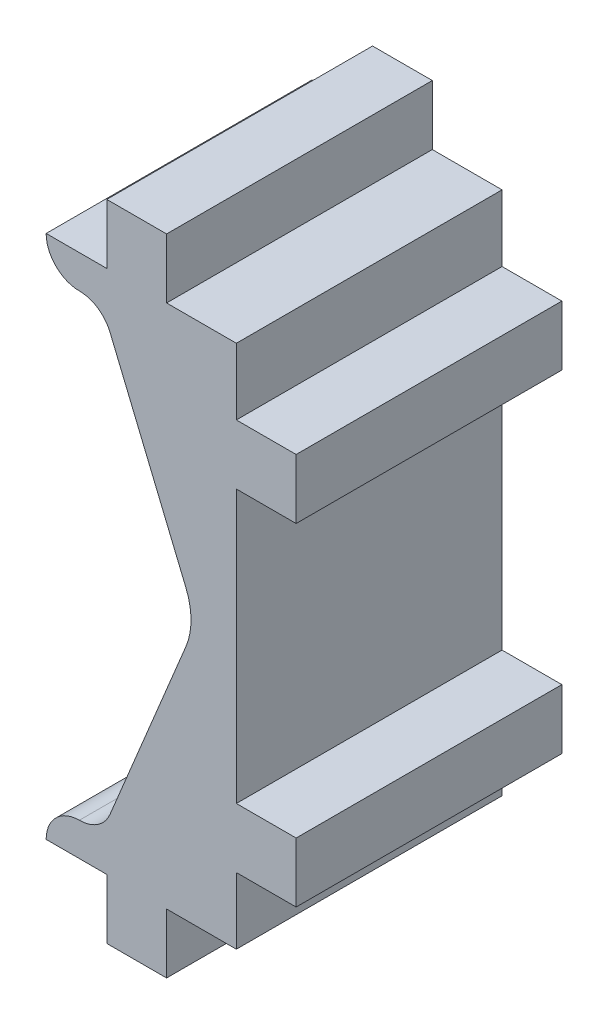
ISO-10303-21;
HEADER;
FILE_DESCRIPTION(('STEP AP214'),'2;1');
FILE_NAME('part.step','',(''),(''),'','','');
FILE_SCHEMA(('AUTOMOTIVE_DESIGN { 1 0 10303 214 1 1 1 1 }'));
ENDSEC;
DATA;
#1=APPLICATION_CONTEXT('core data for automotive mechanical design processes');
#2=APPLICATION_PROTOCOL_DEFINITION('international standard','automotive_design',2000,#1);
#3=PRODUCT_CONTEXT('',#1,'mechanical');
#4=PRODUCT('Part','Part','',(#3));
#5=PRODUCT_RELATED_PRODUCT_CATEGORY('part','',(#4));
#6=PRODUCT_DEFINITION_FORMATION('','',#4);
#7=PRODUCT_DEFINITION_CONTEXT('part definition',#1,'design');
#8=PRODUCT_DEFINITION('design','',#6,#7);
#9=PRODUCT_DEFINITION_SHAPE('','',#8);
#10=(LENGTH_UNIT() NAMED_UNIT(*) SI_UNIT(.MILLI.,.METRE.));
#11=(NAMED_UNIT(*) PLANE_ANGLE_UNIT() SI_UNIT($,.RADIAN.));
#12=(NAMED_UNIT(*) SI_UNIT($,.STERADIAN.) SOLID_ANGLE_UNIT());
#13=UNCERTAINTY_MEASURE_WITH_UNIT(LENGTH_MEASURE(1.E-05),#10,'distance_accuracy_value','');
#14=(GEOMETRIC_REPRESENTATION_CONTEXT(3) GLOBAL_UNCERTAINTY_ASSIGNED_CONTEXT((#13)) GLOBAL_UNIT_ASSIGNED_CONTEXT((#10,
#11,#12)) REPRESENTATION_CONTEXT('',''));
#15=CARTESIAN_POINT('',(0.,0.,0.));
#16=DIRECTION('',(0.,0.,1.));
#17=DIRECTION('',(1.,0.,0.));
#18=AXIS2_PLACEMENT_3D('',#15,#16,#17);
#19=CARTESIAN_POINT('',(0.,0.,8.));
#20=DIRECTION('',(0.923879532511285,-0.382683432365094,0.));
#21=DIRECTION('',(0.382683432365094,0.923879532511285,0.));
#22=AXIS2_PLACEMENT_3D('',#19,#20,#21);
#23=PLANE('',#22);
#24=DIRECTION('',(-0.382683432365094,-0.923879532511285,0.));
#25=VECTOR('',#24,1.);
#26=CARTESIAN_POINT('',(0.,0.,8.));
#27=LINE('',#26,#25);
#28=CARTESIAN_POINT('',(-0.317025335562221,-0.765366864730187,8.));
#29=VERTEX_POINT('',#28);
#30=CARTESIAN_POINT('',(-2.6023726857824,-6.2826834323651,8.));
#31=VERTEX_POINT('',#30);
#32=EDGE_CURVE('E204',#29,#31,#27,.T.);
#33=ORIENTED_EDGE('',*,*,#32,.F.);
#34=DIRECTION('',(0.,0.,-1.));
#35=VECTOR('',#34,1.);
#36=CARTESIAN_POINT('',(-0.317025335562221,-0.765366864730187,0.));
#37=LINE('',#36,#35);
#38=CARTESIAN_POINT('',(-0.317025335562221,-0.765366864730187,0.));
#39=VERTEX_POINT('',#38);
#40=EDGE_CURVE('E227',#29,#39,#37,.T.);
#41=ORIENTED_EDGE('',*,*,#40,.T.);
#42=DIRECTION('',(-0.382683432365094,-0.923879532511285,0.));
#43=VECTOR('',#42,1.);
#44=CARTESIAN_POINT('',(0.,0.,0.));
#45=LINE('',#44,#43);
#46=CARTESIAN_POINT('',(-2.6023726857824,-6.2826834323651,0.));
#47=VERTEX_POINT('',#46);
#48=EDGE_CURVE('E225',#39,#47,#45,.T.);
#49=ORIENTED_EDGE('',*,*,#48,.T.);
#50=DIRECTION('',(0.,0.,-1.));
#51=VECTOR('',#50,1.);
#52=CARTESIAN_POINT('',(-2.6023726857824,-6.2826834323651,8.));
#53=LINE('',#52,#51);
#54=EDGE_CURVE('E219',#31,#47,#53,.T.);
#55=ORIENTED_EDGE('',*,*,#54,.F.);
#56=EDGE_LOOP('',(#33,#41,#49,#55));
#57=FACE_BOUND('',#56,.T.);
#58=ADVANCED_FACE('F32',(#57),#23,.F.);
#59=CARTESIAN_POINT('',(-3.52625221829369,-5.9,8.));
#60=DIRECTION('',(0.,0.,-1.));
#61=DIRECTION('',(-1.,0.,0.));
#62=AXIS2_PLACEMENT_3D('',#59,#60,#61);
#63=CYLINDRICAL_SURFACE('',#62,1.);
#64=CARTESIAN_POINT('',(-3.52625221829369,-5.9,0.));
#65=DIRECTION('',(0.,0.,-1.));
#66=DIRECTION('',(-1.,0.,0.));
#67=AXIS2_PLACEMENT_3D('',#64,#65,#66);
#68=CIRCLE('',#67,1.);
#69=CARTESIAN_POINT('',(-3.52625221829369,-6.9,0.));
#70=VERTEX_POINT('',#69);
#71=EDGE_CURVE('E345',#47,#70,#68,.T.);
#72=ORIENTED_EDGE('',*,*,#71,.T.);
#73=DIRECTION('',(0.,0.,-1.));
#74=VECTOR('',#73,1.);
#75=CARTESIAN_POINT('',(-3.52625221829369,-6.9,8.));
#76=LINE('',#75,#74);
#77=CARTESIAN_POINT('',(-3.52625221829369,-6.9,8.));
#78=VERTEX_POINT('',#77);
#79=EDGE_CURVE('E221',#78,#70,#76,.T.);
#80=ORIENTED_EDGE('',*,*,#79,.F.);
#81=CARTESIAN_POINT('',(-3.52625221829369,-5.9,8.));
#82=DIRECTION('',(0.,0.,-1.));
#83=DIRECTION('',(-1.,0.,0.));
#84=AXIS2_PLACEMENT_3D('',#81,#82,#83);
#85=CIRCLE('',#84,1.);
#86=EDGE_CURVE('E207',#31,#78,#85,.T.);
#87=ORIENTED_EDGE('',*,*,#86,.F.);
#88=ORIENTED_EDGE('',*,*,#54,.T.);
#89=EDGE_LOOP('',(#72,#80,#87,#88));
#90=FACE_BOUND('',#89,.T.);
#91=ADVANCED_FACE('F218',(#90),#63,.F.);
#92=CARTESIAN_POINT('',(-3.52625221829369,-7.9,8.));
#93=DIRECTION('',(0.,0.,-1.));
#94=DIRECTION('',(-1.,0.,0.));
#95=AXIS2_PLACEMENT_3D('',#92,#93,#94);
#96=CYLINDRICAL_SURFACE('',#95,1.);
#97=CARTESIAN_POINT('',(-3.52625221829369,-7.9,0.));
#98=DIRECTION('',(0.,0.,1.));
#99=DIRECTION('',(1.,0.,0.));
#100=AXIS2_PLACEMENT_3D('',#97,#98,#99);
#101=CIRCLE('',#100,1.);
#102=CARTESIAN_POINT('',(-4.52625221829369,-7.9,0.));
#103=VERTEX_POINT('',#102);
#104=EDGE_CURVE('E343',#70,#103,#101,.T.);
#105=ORIENTED_EDGE('',*,*,#104,.T.);
#106=DIRECTION('',(0.,0.,-1.));
#107=VECTOR('',#106,1.);
#108=CARTESIAN_POINT('',(-4.52625221829369,-7.9,8.));
#109=LINE('',#108,#107);
#110=CARTESIAN_POINT('',(-4.52625221829369,-7.9,8.));
#111=VERTEX_POINT('',#110);
#112=EDGE_CURVE('E230',#111,#103,#109,.T.);
#113=ORIENTED_EDGE('',*,*,#112,.F.);
#114=CARTESIAN_POINT('',(-3.52625221829369,-7.9,8.));
#115=DIRECTION('',(0.,0.,1.));
#116=DIRECTION('',(1.,0.,0.));
#117=AXIS2_PLACEMENT_3D('',#114,#115,#116);
#118=CIRCLE('',#117,1.);
#119=EDGE_CURVE('E223',#78,#111,#118,.T.);
#120=ORIENTED_EDGE('',*,*,#119,.F.);
#121=ORIENTED_EDGE('',*,*,#79,.T.);
#122=EDGE_LOOP('',(#105,#113,#120,#121));
#123=FACE_BOUND('',#122,.T.);
#124=ADVANCED_FACE('F395',(#123),#96,.T.);
#125=CARTESIAN_POINT('',(-2.7,-7.9,8.));
#126=DIRECTION('',(0.,1.,0.));
#127=DIRECTION('',(-1.,0.,0.));
#128=AXIS2_PLACEMENT_3D('',#125,#126,#127);
#129=PLANE('',#128);
#130=DIRECTION('',(1.,0.,0.));
#131=VECTOR('',#130,1.);
#132=CARTESIAN_POINT('',(-2.7,-7.9,0.));
#133=LINE('',#132,#131);
#134=CARTESIAN_POINT('',(-2.7,-7.9,0.));
#135=VERTEX_POINT('',#134);
#136=EDGE_CURVE('E341',#103,#135,#133,.T.);
#137=ORIENTED_EDGE('',*,*,#136,.T.);
#138=DIRECTION('',(0.,0.,-1.));
#139=VECTOR('',#138,1.);
#140=CARTESIAN_POINT('',(-2.7,-7.9,8.));
#141=LINE('',#140,#139);
#142=CARTESIAN_POINT('',(-2.7,-7.9,8.));
#143=VERTEX_POINT('',#142);
#144=EDGE_CURVE('E236',#143,#135,#141,.T.);
#145=ORIENTED_EDGE('',*,*,#144,.F.);
#146=DIRECTION('',(1.,0.,0.));
#147=VECTOR('',#146,1.);
#148=CARTESIAN_POINT('',(-2.7,-7.9,8.));
#149=LINE('',#148,#147);
#150=EDGE_CURVE('E389',#111,#143,#149,.T.);
#151=ORIENTED_EDGE('',*,*,#150,.F.);
#152=ORIENTED_EDGE('',*,*,#112,.T.);
#153=EDGE_LOOP('',(#137,#145,#151,#152));
#154=FACE_BOUND('',#153,.T.);
#155=ADVANCED_FACE('F399',(#154),#129,.F.);
#156=CARTESIAN_POINT('',(-2.7,-9.7,8.));
#157=DIRECTION('',(1.,0.,0.));
#158=DIRECTION('',(0.,0.,-1.));
#159=AXIS2_PLACEMENT_3D('',#156,#157,#158);
#160=PLANE('',#159);
#161=DIRECTION('',(0.,-1.,0.));
#162=VECTOR('',#161,1.);
#163=CARTESIAN_POINT('',(-2.7,-9.7,0.));
#164=LINE('',#163,#162);
#165=CARTESIAN_POINT('',(-2.7,-9.7,0.));
#166=VERTEX_POINT('',#165);
#167=EDGE_CURVE('E339',#135,#166,#164,.T.);
#168=ORIENTED_EDGE('',*,*,#167,.T.);
#169=DIRECTION('',(0.,0.,-1.));
#170=VECTOR('',#169,1.);
#171=CARTESIAN_POINT('',(-2.7,-9.7,8.));
#172=LINE('',#171,#170);
#173=CARTESIAN_POINT('',(-2.7,-9.7,8.));
#174=VERTEX_POINT('',#173);
#175=EDGE_CURVE('E239',#174,#166,#172,.T.);
#176=ORIENTED_EDGE('',*,*,#175,.F.);
#177=DIRECTION('',(0.,-1.,0.));
#178=VECTOR('',#177,1.);
#179=CARTESIAN_POINT('',(-2.7,-9.7,8.));
#180=LINE('',#179,#178);
#181=EDGE_CURVE('E387',#143,#174,#180,.T.);
#182=ORIENTED_EDGE('',*,*,#181,.F.);
#183=ORIENTED_EDGE('',*,*,#144,.T.);
#184=EDGE_LOOP('',(#168,#176,#182,#183));
#185=FACE_BOUND('',#184,.T.);
#186=ADVANCED_FACE('F404',(#185),#160,.F.);
#187=CARTESIAN_POINT('',(-0.900000000000001,-9.7,8.));
#188=DIRECTION('',(0.,1.,0.));
#189=DIRECTION('',(-1.,0.,0.));
#190=AXIS2_PLACEMENT_3D('',#187,#188,#189);
#191=PLANE('',#190);
#192=DIRECTION('',(1.,0.,0.));
#193=VECTOR('',#192,1.);
#194=CARTESIAN_POINT('',(-0.900000000000001,-9.7,0.));
#195=LINE('',#194,#193);
#196=CARTESIAN_POINT('',(-0.900000000000001,-9.7,0.));
#197=VERTEX_POINT('',#196);
#198=EDGE_CURVE('E337',#166,#197,#195,.T.);
#199=ORIENTED_EDGE('',*,*,#198,.T.);
#200=DIRECTION('',(0.,0.,-1.));
#201=VECTOR('',#200,1.);
#202=CARTESIAN_POINT('',(-0.900000000000001,-9.7,8.));
#203=LINE('',#202,#201);
#204=CARTESIAN_POINT('',(-0.900000000000001,-9.7,8.));
#205=VERTEX_POINT('',#204);
#206=EDGE_CURVE('E242',#205,#197,#203,.T.);
#207=ORIENTED_EDGE('',*,*,#206,.F.);
#208=DIRECTION('',(1.,0.,0.));
#209=VECTOR('',#208,1.);
#210=CARTESIAN_POINT('',(-0.900000000000001,-9.7,8.));
#211=LINE('',#210,#209);
#212=EDGE_CURVE('E385',#174,#205,#211,.T.);
#213=ORIENTED_EDGE('',*,*,#212,.F.);
#214=ORIENTED_EDGE('',*,*,#175,.T.);
#215=EDGE_LOOP('',(#199,#207,#213,#214));
#216=FACE_BOUND('',#215,.T.);
#217=ADVANCED_FACE('F410',(#216),#191,.F.);
#218=CARTESIAN_POINT('',(-0.900000000000001,-7.9,8.));
#219=DIRECTION('',(-1.,0.,0.));
#220=DIRECTION('',(0.,0.,1.));
#221=AXIS2_PLACEMENT_3D('',#218,#219,#220);
#222=PLANE('',#221);
#223=DIRECTION('',(0.,1.,0.));
#224=VECTOR('',#223,1.);
#225=CARTESIAN_POINT('',(-0.900000000000001,-7.9,0.));
#226=LINE('',#225,#224);
#227=CARTESIAN_POINT('',(-0.900000000000001,-7.9,0.));
#228=VERTEX_POINT('',#227);
#229=EDGE_CURVE('E335',#197,#228,#226,.T.);
#230=ORIENTED_EDGE('',*,*,#229,.T.);
#231=DIRECTION('',(0.,0.,-1.));
#232=VECTOR('',#231,1.);
#233=CARTESIAN_POINT('',(-0.900000000000001,-7.9,8.));
#234=LINE('',#233,#232);
#235=CARTESIAN_POINT('',(-0.900000000000001,-7.9,8.));
#236=VERTEX_POINT('',#235);
#237=EDGE_CURVE('E245',#236,#228,#234,.T.);
#238=ORIENTED_EDGE('',*,*,#237,.F.);
#239=DIRECTION('',(0.,1.,0.));
#240=VECTOR('',#239,1.);
#241=CARTESIAN_POINT('',(-0.900000000000001,-7.9,8.));
#242=LINE('',#241,#240);
#243=EDGE_CURVE('E383',#205,#236,#242,.T.);
#244=ORIENTED_EDGE('',*,*,#243,.F.);
#245=ORIENTED_EDGE('',*,*,#206,.T.);
#246=EDGE_LOOP('',(#230,#238,#244,#245));
#247=FACE_BOUND('',#246,.T.);
#248=ADVANCED_FACE('F414',(#247),#222,.F.);
#249=CARTESIAN_POINT('',(1.2,-7.9,8.));
#250=DIRECTION('',(0.,1.,0.));
#251=DIRECTION('',(-1.,0.,0.));
#252=AXIS2_PLACEMENT_3D('',#249,#250,#251);
#253=PLANE('',#252);
#254=DIRECTION('',(1.,0.,0.));
#255=VECTOR('',#254,1.);
#256=CARTESIAN_POINT('',(1.2,-7.9,0.));
#257=LINE('',#256,#255);
#258=CARTESIAN_POINT('',(1.2,-7.9,0.));
#259=VERTEX_POINT('',#258);
#260=EDGE_CURVE('E333',#228,#259,#257,.T.);
#261=ORIENTED_EDGE('',*,*,#260,.T.);
#262=DIRECTION('',(0.,0.,-1.));
#263=VECTOR('',#262,1.);
#264=CARTESIAN_POINT('',(1.2,-7.9,8.));
#265=LINE('',#264,#263);
#266=CARTESIAN_POINT('',(1.2,-7.9,8.));
#267=VERTEX_POINT('',#266);
#268=EDGE_CURVE('E248',#267,#259,#265,.T.);
#269=ORIENTED_EDGE('',*,*,#268,.F.);
#270=DIRECTION('',(1.,0.,0.));
#271=VECTOR('',#270,1.);
#272=CARTESIAN_POINT('',(1.2,-7.9,8.));
#273=LINE('',#272,#271);
#274=EDGE_CURVE('E381',#236,#267,#273,.T.);
#275=ORIENTED_EDGE('',*,*,#274,.F.);
#276=ORIENTED_EDGE('',*,*,#237,.T.);
#277=EDGE_LOOP('',(#261,#269,#275,#276));
#278=FACE_BOUND('',#277,.T.);
#279=ADVANCED_FACE('F419',(#278),#253,.F.);
#280=CARTESIAN_POINT('',(1.2,-7.9,8.));
#281=DIRECTION('',(-1.,0.,0.));
#282=DIRECTION('',(0.,-1.,0.));
#283=AXIS2_PLACEMENT_3D('',#280,#281,#282);
#284=PLANE('',#283);
#285=DIRECTION('',(0.,1.,0.));
#286=VECTOR('',#285,1.);
#287=CARTESIAN_POINT('',(1.2,-7.9,0.));
#288=LINE('',#287,#286);
#289=CARTESIAN_POINT('',(1.2,-5.9,0.));
#290=VERTEX_POINT('',#289);
#291=EDGE_CURVE('E331',#259,#290,#288,.T.);
#292=ORIENTED_EDGE('',*,*,#291,.T.);
#293=DIRECTION('',(0.,0.,-1.));
#294=VECTOR('',#293,1.);
#295=CARTESIAN_POINT('',(1.2,-5.9,8.));
#296=LINE('',#295,#294);
#297=CARTESIAN_POINT('',(1.2,-5.9,8.));
#298=VERTEX_POINT('',#297);
#299=EDGE_CURVE('E251',#298,#290,#296,.T.);
#300=ORIENTED_EDGE('',*,*,#299,.F.);
#301=DIRECTION('',(0.,1.,0.));
#302=VECTOR('',#301,1.);
#303=CARTESIAN_POINT('',(1.2,-7.9,8.));
#304=LINE('',#303,#302);
#305=EDGE_CURVE('E379',#267,#298,#304,.T.);
#306=ORIENTED_EDGE('',*,*,#305,.F.);
#307=ORIENTED_EDGE('',*,*,#268,.T.);
#308=EDGE_LOOP('',(#292,#300,#306,#307));
#309=FACE_BOUND('',#308,.T.);
#310=ADVANCED_FACE('F425',(#309),#284,.F.);
#311=CARTESIAN_POINT('',(1.2,-5.9,8.));
#312=DIRECTION('',(0.,1.,0.));
#313=DIRECTION('',(0.,0.,1.));
#314=AXIS2_PLACEMENT_3D('',#311,#312,#313);
#315=PLANE('',#314);
#316=DIRECTION('',(1.,0.,0.));
#317=VECTOR('',#316,1.);
#318=CARTESIAN_POINT('',(1.2,-5.9,0.));
#319=LINE('',#318,#317);
#320=CARTESIAN_POINT('',(3.,-5.9,0.));
#321=VERTEX_POINT('',#320);
#322=EDGE_CURVE('E329',#290,#321,#319,.T.);
#323=ORIENTED_EDGE('',*,*,#322,.T.);
#324=DIRECTION('',(0.,0.,-1.));
#325=VECTOR('',#324,1.);
#326=CARTESIAN_POINT('',(3.,-5.9,8.));
#327=LINE('',#326,#325);
#328=CARTESIAN_POINT('',(3.,-5.9,8.));
#329=VERTEX_POINT('',#328);
#330=EDGE_CURVE('E254',#329,#321,#327,.T.);
#331=ORIENTED_EDGE('',*,*,#330,.F.);
#332=DIRECTION('',(1.,0.,0.));
#333=VECTOR('',#332,1.);
#334=CARTESIAN_POINT('',(1.2,-5.9,8.));
#335=LINE('',#334,#333);
#336=EDGE_CURVE('E377',#298,#329,#335,.T.);
#337=ORIENTED_EDGE('',*,*,#336,.F.);
#338=ORIENTED_EDGE('',*,*,#299,.T.);
#339=EDGE_LOOP('',(#323,#331,#337,#338));
#340=FACE_BOUND('',#339,.T.);
#341=ADVANCED_FACE('F429',(#340),#315,.F.);
#342=CARTESIAN_POINT('',(3.,-5.9,8.));
#343=DIRECTION('',(-1.,0.,0.));
#344=DIRECTION('',(0.,-1.,0.));
#345=AXIS2_PLACEMENT_3D('',#342,#343,#344);
#346=PLANE('',#345);
#347=DIRECTION('',(0.,1.,0.));
#348=VECTOR('',#347,1.);
#349=CARTESIAN_POINT('',(3.,-5.9,0.));
#350=LINE('',#349,#348);
#351=CARTESIAN_POINT('',(3.,-4.1,0.));
#352=VERTEX_POINT('',#351);
#353=EDGE_CURVE('E327',#321,#352,#350,.T.);
#354=ORIENTED_EDGE('',*,*,#353,.T.);
#355=DIRECTION('',(0.,0.,-1.));
#356=VECTOR('',#355,1.);
#357=CARTESIAN_POINT('',(3.,-4.1,8.));
#358=LINE('',#357,#356);
#359=CARTESIAN_POINT('',(3.,-4.1,8.));
#360=VERTEX_POINT('',#359);
#361=EDGE_CURVE('E257',#360,#352,#358,.T.);
#362=ORIENTED_EDGE('',*,*,#361,.F.);
#363=DIRECTION('',(0.,1.,0.));
#364=VECTOR('',#363,1.);
#365=CARTESIAN_POINT('',(3.,-5.9,8.));
#366=LINE('',#365,#364);
#367=EDGE_CURVE('E375',#329,#360,#366,.T.);
#368=ORIENTED_EDGE('',*,*,#367,.F.);
#369=ORIENTED_EDGE('',*,*,#330,.T.);
#370=EDGE_LOOP('',(#354,#362,#368,#369));
#371=FACE_BOUND('',#370,.T.);
#372=ADVANCED_FACE('F434',(#371),#346,.F.);
#373=CARTESIAN_POINT('',(3.,-4.1,8.));
#374=DIRECTION('',(0.,-1.,0.));
#375=DIRECTION('',(0.,0.,-1.));
#376=AXIS2_PLACEMENT_3D('',#373,#374,#375);
#377=PLANE('',#376);
#378=DIRECTION('',(-1.,0.,0.));
#379=VECTOR('',#378,1.);
#380=CARTESIAN_POINT('',(3.,-4.1,0.));
#381=LINE('',#380,#379);
#382=CARTESIAN_POINT('',(1.2,-4.1,0.));
#383=VERTEX_POINT('',#382);
#384=EDGE_CURVE('E325',#352,#383,#381,.T.);
#385=ORIENTED_EDGE('',*,*,#384,.T.);
#386=DIRECTION('',(0.,0.,-1.));
#387=VECTOR('',#386,1.);
#388=CARTESIAN_POINT('',(1.2,-4.1,8.));
#389=LINE('',#388,#387);
#390=CARTESIAN_POINT('',(1.2,-4.1,8.));
#391=VERTEX_POINT('',#390);
#392=EDGE_CURVE('E260',#391,#383,#389,.T.);
#393=ORIENTED_EDGE('',*,*,#392,.F.);
#394=DIRECTION('',(-1.,0.,0.));
#395=VECTOR('',#394,1.);
#396=CARTESIAN_POINT('',(3.,-4.1,8.));
#397=LINE('',#396,#395);
#398=EDGE_CURVE('E373',#360,#391,#397,.T.);
#399=ORIENTED_EDGE('',*,*,#398,.F.);
#400=ORIENTED_EDGE('',*,*,#361,.T.);
#401=EDGE_LOOP('',(#385,#393,#399,#400));
#402=FACE_BOUND('',#401,.T.);
#403=ADVANCED_FACE('F440',(#402),#377,.F.);
#404=CARTESIAN_POINT('',(1.2,4.1,8.));
#405=DIRECTION('',(-1.,0.,0.));
#406=DIRECTION('',(0.,0.,1.));
#407=AXIS2_PLACEMENT_3D('',#404,#405,#406);
#408=PLANE('',#407);
#409=DIRECTION('',(0.,1.,0.));
#410=VECTOR('',#409,1.);
#411=CARTESIAN_POINT('',(1.2,4.1,0.));
#412=LINE('',#411,#410);
#413=CARTESIAN_POINT('',(1.2,4.1,0.));
#414=VERTEX_POINT('',#413);
#415=EDGE_CURVE('E323',#383,#414,#412,.T.);
#416=ORIENTED_EDGE('',*,*,#415,.T.);
#417=DIRECTION('',(0.,0.,-1.));
#418=VECTOR('',#417,1.);
#419=CARTESIAN_POINT('',(1.2,4.1,8.));
#420=LINE('',#419,#418);
#421=CARTESIAN_POINT('',(1.2,4.1,8.));
#422=VERTEX_POINT('',#421);
#423=EDGE_CURVE('E263',#422,#414,#420,.T.);
#424=ORIENTED_EDGE('',*,*,#423,.F.);
#425=DIRECTION('',(0.,1.,0.));
#426=VECTOR('',#425,1.);
#427=CARTESIAN_POINT('',(1.2,4.1,8.));
#428=LINE('',#427,#426);
#429=EDGE_CURVE('E371',#391,#422,#428,.T.);
#430=ORIENTED_EDGE('',*,*,#429,.F.);
#431=ORIENTED_EDGE('',*,*,#392,.T.);
#432=EDGE_LOOP('',(#416,#424,#430,#431));
#433=FACE_BOUND('',#432,.T.);
#434=ADVANCED_FACE('F444',(#433),#408,.F.);
#435=CARTESIAN_POINT('',(3.,4.1,8.));
#436=DIRECTION('',(0.,1.,0.));
#437=DIRECTION('',(0.,0.,1.));
#438=AXIS2_PLACEMENT_3D('',#435,#436,#437);
#439=PLANE('',#438);
#440=DIRECTION('',(1.,0.,0.));
#441=VECTOR('',#440,1.);
#442=CARTESIAN_POINT('',(3.,4.1,0.));
#443=LINE('',#442,#441);
#444=CARTESIAN_POINT('',(3.,4.1,0.));
#445=VERTEX_POINT('',#444);
#446=EDGE_CURVE('E321',#414,#445,#443,.T.);
#447=ORIENTED_EDGE('',*,*,#446,.T.);
#448=DIRECTION('',(0.,0.,-1.));
#449=VECTOR('',#448,1.);
#450=CARTESIAN_POINT('',(3.,4.1,8.));
#451=LINE('',#450,#449);
#452=CARTESIAN_POINT('',(3.,4.1,8.));
#453=VERTEX_POINT('',#452);
#454=EDGE_CURVE('E266',#453,#445,#451,.T.);
#455=ORIENTED_EDGE('',*,*,#454,.F.);
#456=DIRECTION('',(1.,0.,0.));
#457=VECTOR('',#456,1.);
#458=CARTESIAN_POINT('',(3.,4.1,8.));
#459=LINE('',#458,#457);
#460=EDGE_CURVE('E369',#422,#453,#459,.T.);
#461=ORIENTED_EDGE('',*,*,#460,.F.);
#462=ORIENTED_EDGE('',*,*,#423,.T.);
#463=EDGE_LOOP('',(#447,#455,#461,#462));
#464=FACE_BOUND('',#463,.T.);
#465=ADVANCED_FACE('F449',(#464),#439,.F.);
#466=CARTESIAN_POINT('',(3.,5.9,8.));
#467=DIRECTION('',(-1.,0.,0.));
#468=DIRECTION('',(0.,-1.,0.));
#469=AXIS2_PLACEMENT_3D('',#466,#467,#468);
#470=PLANE('',#469);
#471=DIRECTION('',(0.,1.,0.));
#472=VECTOR('',#471,1.);
#473=CARTESIAN_POINT('',(3.,5.9,0.));
#474=LINE('',#473,#472);
#475=CARTESIAN_POINT('',(3.,5.9,0.));
#476=VERTEX_POINT('',#475);
#477=EDGE_CURVE('E319',#445,#476,#474,.T.);
#478=ORIENTED_EDGE('',*,*,#477,.T.);
#479=DIRECTION('',(0.,0.,-1.));
#480=VECTOR('',#479,1.);
#481=CARTESIAN_POINT('',(3.,5.9,8.));
#482=LINE('',#481,#480);
#483=CARTESIAN_POINT('',(3.,5.9,8.));
#484=VERTEX_POINT('',#483);
#485=EDGE_CURVE('E269',#484,#476,#482,.T.);
#486=ORIENTED_EDGE('',*,*,#485,.F.);
#487=DIRECTION('',(0.,1.,0.));
#488=VECTOR('',#487,1.);
#489=CARTESIAN_POINT('',(3.,5.9,8.));
#490=LINE('',#489,#488);
#491=EDGE_CURVE('E367',#453,#484,#490,.T.);
#492=ORIENTED_EDGE('',*,*,#491,.F.);
#493=ORIENTED_EDGE('',*,*,#454,.T.);
#494=EDGE_LOOP('',(#478,#486,#492,#493));
#495=FACE_BOUND('',#494,.T.);
#496=ADVANCED_FACE('F455',(#495),#470,.F.);
#497=CARTESIAN_POINT('',(1.2,5.9,8.));
#498=DIRECTION('',(0.,-1.,0.));
#499=DIRECTION('',(0.,0.,-1.));
#500=AXIS2_PLACEMENT_3D('',#497,#498,#499);
#501=PLANE('',#500);
#502=DIRECTION('',(-1.,0.,0.));
#503=VECTOR('',#502,1.);
#504=CARTESIAN_POINT('',(1.2,5.9,0.));
#505=LINE('',#504,#503);
#506=CARTESIAN_POINT('',(1.2,5.9,0.));
#507=VERTEX_POINT('',#506);
#508=EDGE_CURVE('E317',#476,#507,#505,.T.);
#509=ORIENTED_EDGE('',*,*,#508,.T.);
#510=DIRECTION('',(0.,0.,-1.));
#511=VECTOR('',#510,1.);
#512=CARTESIAN_POINT('',(1.2,5.9,8.));
#513=LINE('',#512,#511);
#514=CARTESIAN_POINT('',(1.2,5.9,8.));
#515=VERTEX_POINT('',#514);
#516=EDGE_CURVE('E272',#515,#507,#513,.T.);
#517=ORIENTED_EDGE('',*,*,#516,.F.);
#518=DIRECTION('',(-1.,0.,0.));
#519=VECTOR('',#518,1.);
#520=CARTESIAN_POINT('',(1.2,5.9,8.));
#521=LINE('',#520,#519);
#522=EDGE_CURVE('E365',#484,#515,#521,.T.);
#523=ORIENTED_EDGE('',*,*,#522,.F.);
#524=ORIENTED_EDGE('',*,*,#485,.T.);
#525=EDGE_LOOP('',(#509,#517,#523,#524));
#526=FACE_BOUND('',#525,.T.);
#527=ADVANCED_FACE('F459',(#526),#501,.F.);
#528=CARTESIAN_POINT('',(1.2,7.9,8.));
#529=DIRECTION('',(-1.,0.,0.));
#530=DIRECTION('',(0.,-1.,0.));
#531=AXIS2_PLACEMENT_3D('',#528,#529,#530);
#532=PLANE('',#531);
#533=DIRECTION('',(0.,1.,0.));
#534=VECTOR('',#533,1.);
#535=CARTESIAN_POINT('',(1.2,7.9,0.));
#536=LINE('',#535,#534);
#537=CARTESIAN_POINT('',(1.2,7.9,0.));
#538=VERTEX_POINT('',#537);
#539=EDGE_CURVE('E315',#507,#538,#536,.T.);
#540=ORIENTED_EDGE('',*,*,#539,.T.);
#541=DIRECTION('',(0.,0.,-1.));
#542=VECTOR('',#541,1.);
#543=CARTESIAN_POINT('',(1.2,7.9,8.));
#544=LINE('',#543,#542);
#545=CARTESIAN_POINT('',(1.2,7.9,8.));
#546=VERTEX_POINT('',#545);
#547=EDGE_CURVE('E275',#546,#538,#544,.T.);
#548=ORIENTED_EDGE('',*,*,#547,.F.);
#549=DIRECTION('',(0.,1.,0.));
#550=VECTOR('',#549,1.);
#551=CARTESIAN_POINT('',(1.2,7.9,8.));
#552=LINE('',#551,#550);
#553=EDGE_CURVE('E363',#515,#546,#552,.T.);
#554=ORIENTED_EDGE('',*,*,#553,.F.);
#555=ORIENTED_EDGE('',*,*,#516,.T.);
#556=EDGE_LOOP('',(#540,#548,#554,#555));
#557=FACE_BOUND('',#556,.T.);
#558=ADVANCED_FACE('F464',(#557),#532,.F.);
#559=CARTESIAN_POINT('',(1.2,7.9,8.));
#560=DIRECTION('',(0.,-1.,0.));
#561=DIRECTION('',(1.,0.,0.));
#562=AXIS2_PLACEMENT_3D('',#559,#560,#561);
#563=PLANE('',#562);
#564=DIRECTION('',(-1.,0.,0.));
#565=VECTOR('',#564,1.);
#566=CARTESIAN_POINT('',(1.2,7.9,0.));
#567=LINE('',#566,#565);
#568=CARTESIAN_POINT('',(-0.900000000000001,7.9,0.));
#569=VERTEX_POINT('',#568);
#570=EDGE_CURVE('E313',#538,#569,#567,.T.);
#571=ORIENTED_EDGE('',*,*,#570,.T.);
#572=DIRECTION('',(0.,0.,-1.));
#573=VECTOR('',#572,1.);
#574=CARTESIAN_POINT('',(-0.900000000000001,7.9,8.));
#575=LINE('',#574,#573);
#576=CARTESIAN_POINT('',(-0.900000000000001,7.9,8.));
#577=VERTEX_POINT('',#576);
#578=EDGE_CURVE('E278',#577,#569,#575,.T.);
#579=ORIENTED_EDGE('',*,*,#578,.F.);
#580=DIRECTION('',(-1.,0.,0.));
#581=VECTOR('',#580,1.);
#582=CARTESIAN_POINT('',(1.2,7.9,8.));
#583=LINE('',#582,#581);
#584=EDGE_CURVE('E361',#546,#577,#583,.T.);
#585=ORIENTED_EDGE('',*,*,#584,.F.);
#586=ORIENTED_EDGE('',*,*,#547,.T.);
#587=EDGE_LOOP('',(#571,#579,#585,#586));
#588=FACE_BOUND('',#587,.T.);
#589=ADVANCED_FACE('F470',(#588),#563,.F.);
#590=CARTESIAN_POINT('',(-0.900000000000001,7.9,8.));
#591=DIRECTION('',(-1.,0.,0.));
#592=DIRECTION('',(0.,0.,1.));
#593=AXIS2_PLACEMENT_3D('',#590,#591,#592);
#594=PLANE('',#593);
#595=DIRECTION('',(0.,1.,0.));
#596=VECTOR('',#595,1.);
#597=CARTESIAN_POINT('',(-0.900000000000001,7.9,0.));
#598=LINE('',#597,#596);
#599=CARTESIAN_POINT('',(-0.900000000000001,9.7,0.));
#600=VERTEX_POINT('',#599);
#601=EDGE_CURVE('E311',#569,#600,#598,.T.);
#602=ORIENTED_EDGE('',*,*,#601,.T.);
#603=DIRECTION('',(0.,0.,-1.));
#604=VECTOR('',#603,1.);
#605=CARTESIAN_POINT('',(-0.900000000000001,9.7,8.));
#606=LINE('',#605,#604);
#607=CARTESIAN_POINT('',(-0.900000000000001,9.7,8.));
#608=VERTEX_POINT('',#607);
#609=EDGE_CURVE('E281',#608,#600,#606,.T.);
#610=ORIENTED_EDGE('',*,*,#609,.F.);
#611=DIRECTION('',(0.,1.,0.));
#612=VECTOR('',#611,1.);
#613=CARTESIAN_POINT('',(-0.900000000000001,7.9,8.));
#614=LINE('',#613,#612);
#615=EDGE_CURVE('E359',#577,#608,#614,.T.);
#616=ORIENTED_EDGE('',*,*,#615,.F.);
#617=ORIENTED_EDGE('',*,*,#578,.T.);
#618=EDGE_LOOP('',(#602,#610,#616,#617));
#619=FACE_BOUND('',#618,.T.);
#620=ADVANCED_FACE('F474',(#619),#594,.F.);
#621=CARTESIAN_POINT('',(-0.900000000000001,9.7,8.));
#622=DIRECTION('',(0.,-1.,0.));
#623=DIRECTION('',(1.,0.,0.));
#624=AXIS2_PLACEMENT_3D('',#621,#622,#623);
#625=PLANE('',#624);
#626=DIRECTION('',(-1.,0.,0.));
#627=VECTOR('',#626,1.);
#628=CARTESIAN_POINT('',(-0.900000000000001,9.7,0.));
#629=LINE('',#628,#627);
#630=CARTESIAN_POINT('',(-2.7,9.7,0.));
#631=VERTEX_POINT('',#630);
#632=EDGE_CURVE('E309',#600,#631,#629,.T.);
#633=ORIENTED_EDGE('',*,*,#632,.T.);
#634=DIRECTION('',(0.,0.,-1.));
#635=VECTOR('',#634,1.);
#636=CARTESIAN_POINT('',(-2.7,9.7,8.));
#637=LINE('',#636,#635);
#638=CARTESIAN_POINT('',(-2.7,9.7,8.));
#639=VERTEX_POINT('',#638);
#640=EDGE_CURVE('E284',#639,#631,#637,.T.);
#641=ORIENTED_EDGE('',*,*,#640,.F.);
#642=DIRECTION('',(-1.,0.,0.));
#643=VECTOR('',#642,1.);
#644=CARTESIAN_POINT('',(-0.900000000000001,9.7,8.));
#645=LINE('',#644,#643);
#646=EDGE_CURVE('E357',#608,#639,#645,.T.);
#647=ORIENTED_EDGE('',*,*,#646,.F.);
#648=ORIENTED_EDGE('',*,*,#609,.T.);
#649=EDGE_LOOP('',(#633,#641,#647,#648));
#650=FACE_BOUND('',#649,.T.);
#651=ADVANCED_FACE('F479',(#650),#625,.F.);
#652=CARTESIAN_POINT('',(-2.7,9.7,8.));
#653=DIRECTION('',(1.,0.,0.));
#654=DIRECTION('',(0.,0.,-1.));
#655=AXIS2_PLACEMENT_3D('',#652,#653,#654);
#656=PLANE('',#655);
#657=DIRECTION('',(0.,-1.,0.));
#658=VECTOR('',#657,1.);
#659=CARTESIAN_POINT('',(-2.7,9.7,0.));
#660=LINE('',#659,#658);
#661=CARTESIAN_POINT('',(-2.7,7.9,0.));
#662=VERTEX_POINT('',#661);
#663=EDGE_CURVE('E307',#631,#662,#660,.T.);
#664=ORIENTED_EDGE('',*,*,#663,.T.);
#665=DIRECTION('',(0.,0.,-1.));
#666=VECTOR('',#665,1.);
#667=CARTESIAN_POINT('',(-2.7,7.9,8.));
#668=LINE('',#667,#666);
#669=CARTESIAN_POINT('',(-2.7,7.9,8.));
#670=VERTEX_POINT('',#669);
#671=EDGE_CURVE('E287',#670,#662,#668,.T.);
#672=ORIENTED_EDGE('',*,*,#671,.F.);
#673=DIRECTION('',(0.,-1.,0.));
#674=VECTOR('',#673,1.);
#675=CARTESIAN_POINT('',(-2.7,9.7,8.));
#676=LINE('',#675,#674);
#677=EDGE_CURVE('E355',#639,#670,#676,.T.);
#678=ORIENTED_EDGE('',*,*,#677,.F.);
#679=ORIENTED_EDGE('',*,*,#640,.T.);
#680=EDGE_LOOP('',(#664,#672,#678,#679));
#681=FACE_BOUND('',#680,.T.);
#682=ADVANCED_FACE('F485',(#681),#656,.F.);
#683=CARTESIAN_POINT('',(-2.7,7.9,8.));
#684=DIRECTION('',(0.,-1.,0.));
#685=DIRECTION('',(1.,0.,0.));
#686=AXIS2_PLACEMENT_3D('',#683,#684,#685);
#687=PLANE('',#686);
#688=DIRECTION('',(-1.,0.,0.));
#689=VECTOR('',#688,1.);
#690=CARTESIAN_POINT('',(-2.7,7.9,0.));
#691=LINE('',#690,#689);
#692=CARTESIAN_POINT('',(-4.52625221829369,7.9,0.));
#693=VERTEX_POINT('',#692);
#694=EDGE_CURVE('E305',#662,#693,#691,.T.);
#695=ORIENTED_EDGE('',*,*,#694,.T.);
#696=DIRECTION('',(0.,0.,-1.));
#697=VECTOR('',#696,1.);
#698=CARTESIAN_POINT('',(-4.52625221829369,7.9,8.));
#699=LINE('',#698,#697);
#700=CARTESIAN_POINT('',(-4.52625221829369,7.9,8.));
#701=VERTEX_POINT('',#700);
#702=EDGE_CURVE('E290',#701,#693,#699,.T.);
#703=ORIENTED_EDGE('',*,*,#702,.F.);
#704=DIRECTION('',(-1.,0.,0.));
#705=VECTOR('',#704,1.);
#706=CARTESIAN_POINT('',(-2.7,7.9,8.));
#707=LINE('',#706,#705);
#708=EDGE_CURVE('E353',#670,#701,#707,.T.);
#709=ORIENTED_EDGE('',*,*,#708,.F.);
#710=ORIENTED_EDGE('',*,*,#671,.T.);
#711=EDGE_LOOP('',(#695,#703,#709,#710));
#712=FACE_BOUND('',#711,.T.);
#713=ADVANCED_FACE('F489',(#712),#687,.F.);
#714=CARTESIAN_POINT('',(-3.52625221829369,7.9,8.));
#715=DIRECTION('',(0.,0.,-1.));
#716=DIRECTION('',(-1.,0.,0.));
#717=AXIS2_PLACEMENT_3D('',#714,#715,#716);
#718=CYLINDRICAL_SURFACE('',#717,1.);
#719=CARTESIAN_POINT('',(-3.52625221829369,7.9,0.));
#720=DIRECTION('',(0.,0.,1.));
#721=DIRECTION('',(-1.,0.,0.));
#722=AXIS2_PLACEMENT_3D('',#719,#720,#721);
#723=CIRCLE('',#722,1.);
#724=CARTESIAN_POINT('',(-3.52625221829369,6.9,0.));
#725=VERTEX_POINT('',#724);
#726=EDGE_CURVE('E303',#693,#725,#723,.T.);
#727=ORIENTED_EDGE('',*,*,#726,.T.);
#728=DIRECTION('',(0.,0.,-1.));
#729=VECTOR('',#728,1.);
#730=CARTESIAN_POINT('',(-3.52625221829369,6.9,8.));
#731=LINE('',#730,#729);
#732=CARTESIAN_POINT('',(-3.52625221829369,6.9,8.));
#733=VERTEX_POINT('',#732);
#734=EDGE_CURVE('E293',#733,#725,#731,.T.);
#735=ORIENTED_EDGE('',*,*,#734,.F.);
#736=CARTESIAN_POINT('',(-3.52625221829369,7.9,8.));
#737=DIRECTION('',(0.,0.,1.));
#738=DIRECTION('',(-1.,0.,0.));
#739=AXIS2_PLACEMENT_3D('',#736,#737,#738);
#740=CIRCLE('',#739,1.);
#741=EDGE_CURVE('E351',#701,#733,#740,.T.);
#742=ORIENTED_EDGE('',*,*,#741,.F.);
#743=ORIENTED_EDGE('',*,*,#702,.T.);
#744=EDGE_LOOP('',(#727,#735,#742,#743));
#745=FACE_BOUND('',#744,.T.);
#746=ADVANCED_FACE('F494',(#745),#718,.T.);
#747=CARTESIAN_POINT('',(-3.52625221829369,5.9,8.));
#748=DIRECTION('',(0.,0.,-1.));
#749=DIRECTION('',(-1.,0.,0.));
#750=AXIS2_PLACEMENT_3D('',#747,#748,#749);
#751=CYLINDRICAL_SURFACE('',#750,1.);
#752=CARTESIAN_POINT('',(-3.52625221829369,5.9,0.));
#753=DIRECTION('',(0.,0.,-1.));
#754=DIRECTION('',(1.,0.,0.));
#755=AXIS2_PLACEMENT_3D('',#752,#753,#754);
#756=CIRCLE('',#755,1.);
#757=CARTESIAN_POINT('',(-2.6023726857824,6.2826834323651,0.));
#758=VERTEX_POINT('',#757);
#759=EDGE_CURVE('E301',#725,#758,#756,.T.);
#760=ORIENTED_EDGE('',*,*,#759,.T.);
#761=DIRECTION('',(0.,0.,-1.));
#762=VECTOR('',#761,1.);
#763=CARTESIAN_POINT('',(-2.6023726857824,6.2826834323651,8.));
#764=LINE('',#763,#762);
#765=CARTESIAN_POINT('',(-2.6023726857824,6.2826834323651,8.));
#766=VERTEX_POINT('',#765);
#767=EDGE_CURVE('E296',#766,#758,#764,.T.);
#768=ORIENTED_EDGE('',*,*,#767,.F.);
#769=CARTESIAN_POINT('',(-3.52625221829369,5.9,8.));
#770=DIRECTION('',(0.,0.,-1.));
#771=DIRECTION('',(1.,0.,0.));
#772=AXIS2_PLACEMENT_3D('',#769,#770,#771);
#773=CIRCLE('',#772,1.);
#774=EDGE_CURVE('E349',#733,#766,#773,.T.);
#775=ORIENTED_EDGE('',*,*,#774,.F.);
#776=ORIENTED_EDGE('',*,*,#734,.T.);
#777=EDGE_LOOP('',(#760,#768,#775,#776));
#778=FACE_BOUND('',#777,.T.);
#779=ADVANCED_FACE('F498',(#778),#751,.F.);
#780=CARTESIAN_POINT('',(0.,0.,8.));
#781=DIRECTION('',(0.923879532511285,0.382683432365094,0.));
#782=DIRECTION('',(-0.382683432365094,0.923879532511285,0.));
#783=AXIS2_PLACEMENT_3D('',#780,#781,#782);
#784=PLANE('',#783);
#785=DIRECTION('',(0.382683432365094,-0.923879532511285,0.));
#786=VECTOR('',#785,1.);
#787=CARTESIAN_POINT('',(0.,0.,0.));
#788=LINE('',#787,#786);
#789=CARTESIAN_POINT('',(-0.317025335562221,0.765366864730187,0.));
#790=VERTEX_POINT('',#789);
#791=EDGE_CURVE('E214',#758,#790,#788,.T.);
#792=ORIENTED_EDGE('',*,*,#791,.T.);
#793=DIRECTION('',(0.,0.,-1.));
#794=VECTOR('',#793,1.);
#795=CARTESIAN_POINT('',(-0.317025335562221,0.765366864730187,8.));
#796=LINE('',#795,#794);
#797=CARTESIAN_POINT('',(-0.317025335562221,0.765366864730187,8.));
#798=VERTEX_POINT('',#797);
#799=EDGE_CURVE('E47',#790,#798,#796,.F.);
#800=ORIENTED_EDGE('',*,*,#799,.T.);
#801=DIRECTION('',(0.382683432365094,-0.923879532511285,0.));
#802=VECTOR('',#801,1.);
#803=CARTESIAN_POINT('',(0.,0.,8.));
#804=LINE('',#803,#802);
#805=EDGE_CURVE('E299',#766,#798,#804,.T.);
#806=ORIENTED_EDGE('',*,*,#805,.F.);
#807=ORIENTED_EDGE('',*,*,#767,.T.);
#808=EDGE_LOOP('',(#792,#800,#806,#807));
#809=FACE_BOUND('',#808,.T.);
#810=ADVANCED_FACE('F500',(#809),#784,.F.);
#811=CARTESIAN_POINT('',(-3.52625221829369,-5.9,8.));
#812=DIRECTION('',(0.,0.,-1.));
#813=DIRECTION('',(-1.,0.,0.));
#814=AXIS2_PLACEMENT_3D('',#811,#812,#813);
#815=PLANE('',#814);
#816=ORIENTED_EDGE('',*,*,#805,.T.);
#817=CARTESIAN_POINT('',(-2.16478440058479,0.,8.));
#818=DIRECTION('',(0.,0.,-1.));
#819=DIRECTION('',(-1.,0.,0.));
#820=AXIS2_PLACEMENT_3D('',#817,#818,#819);
#821=CIRCLE('',#820,2.);
#822=EDGE_CURVE('E11',#798,#29,#821,.T.);
#823=ORIENTED_EDGE('',*,*,#822,.T.);
#824=ORIENTED_EDGE('',*,*,#32,.T.);
#825=ORIENTED_EDGE('',*,*,#86,.T.);
#826=ORIENTED_EDGE('',*,*,#119,.T.);
#827=ORIENTED_EDGE('',*,*,#150,.T.);
#828=ORIENTED_EDGE('',*,*,#181,.T.);
#829=ORIENTED_EDGE('',*,*,#212,.T.);
#830=ORIENTED_EDGE('',*,*,#243,.T.);
#831=ORIENTED_EDGE('',*,*,#274,.T.);
#832=ORIENTED_EDGE('',*,*,#305,.T.);
#833=ORIENTED_EDGE('',*,*,#336,.T.);
#834=ORIENTED_EDGE('',*,*,#367,.T.);
#835=ORIENTED_EDGE('',*,*,#398,.T.);
#836=ORIENTED_EDGE('',*,*,#429,.T.);
#837=ORIENTED_EDGE('',*,*,#460,.T.);
#838=ORIENTED_EDGE('',*,*,#491,.T.);
#839=ORIENTED_EDGE('',*,*,#522,.T.);
#840=ORIENTED_EDGE('',*,*,#553,.T.);
#841=ORIENTED_EDGE('',*,*,#584,.T.);
#842=ORIENTED_EDGE('',*,*,#615,.T.);
#843=ORIENTED_EDGE('',*,*,#646,.T.);
#844=ORIENTED_EDGE('',*,*,#677,.T.);
#845=ORIENTED_EDGE('',*,*,#708,.T.);
#846=ORIENTED_EDGE('',*,*,#741,.T.);
#847=ORIENTED_EDGE('',*,*,#774,.T.);
#848=EDGE_LOOP('',(#816,#823,#824,#825,#826,#827,#828,#829,#830,#831,#832,#833,#834,#835,#836,
#837,#838,#839,#840,#841,#842,#843,#844,#845,#846,#847));
#849=FACE_BOUND('',#848,.T.);
#850=ADVANCED_FACE('F206',(#849),#815,.F.);
#851=CARTESIAN_POINT('',(-3.52625221829369,-5.9,0.));
#852=DIRECTION('',(0.,0.,-1.));
#853=DIRECTION('',(-1.,0.,0.));
#854=AXIS2_PLACEMENT_3D('',#851,#852,#853);
#855=PLANE('',#854);
#856=ORIENTED_EDGE('',*,*,#48,.F.);
#857=CARTESIAN_POINT('',(-2.16478440058479,0.,0.));
#858=DIRECTION('',(0.,0.,-1.));
#859=DIRECTION('',(-1.,0.,0.));
#860=AXIS2_PLACEMENT_3D('',#857,#858,#859);
#861=CIRCLE('',#860,2.);
#862=EDGE_CURVE('E40',#39,#790,#861,.F.);
#863=ORIENTED_EDGE('',*,*,#862,.T.);
#864=ORIENTED_EDGE('',*,*,#791,.F.);
#865=ORIENTED_EDGE('',*,*,#759,.F.);
#866=ORIENTED_EDGE('',*,*,#726,.F.);
#867=ORIENTED_EDGE('',*,*,#694,.F.);
#868=ORIENTED_EDGE('',*,*,#663,.F.);
#869=ORIENTED_EDGE('',*,*,#632,.F.);
#870=ORIENTED_EDGE('',*,*,#601,.F.);
#871=ORIENTED_EDGE('',*,*,#570,.F.);
#872=ORIENTED_EDGE('',*,*,#539,.F.);
#873=ORIENTED_EDGE('',*,*,#508,.F.);
#874=ORIENTED_EDGE('',*,*,#477,.F.);
#875=ORIENTED_EDGE('',*,*,#446,.F.);
#876=ORIENTED_EDGE('',*,*,#415,.F.);
#877=ORIENTED_EDGE('',*,*,#384,.F.);
#878=ORIENTED_EDGE('',*,*,#353,.F.);
#879=ORIENTED_EDGE('',*,*,#322,.F.);
#880=ORIENTED_EDGE('',*,*,#291,.F.);
#881=ORIENTED_EDGE('',*,*,#260,.F.);
#882=ORIENTED_EDGE('',*,*,#229,.F.);
#883=ORIENTED_EDGE('',*,*,#198,.F.);
#884=ORIENTED_EDGE('',*,*,#167,.F.);
#885=ORIENTED_EDGE('',*,*,#136,.F.);
#886=ORIENTED_EDGE('',*,*,#104,.F.);
#887=ORIENTED_EDGE('',*,*,#71,.F.);
#888=EDGE_LOOP('',(#856,#863,#864,#865,#866,#867,#868,#869,#870,#871,#872,#873,#874,#875,#876,
#877,#878,#879,#880,#881,#882,#883,#884,#885,#886,#887));
#889=FACE_BOUND('',#888,.T.);
#890=ADVANCED_FACE('F507',(#889),#855,.T.);
#891=CARTESIAN_POINT('',(-2.16478440058479,0.,8.));
#892=DIRECTION('',(0.,0.,1.));
#893=DIRECTION('',(1.,0.,0.));
#894=AXIS2_PLACEMENT_3D('',#891,#892,#893);
#895=CYLINDRICAL_SURFACE('',#894,2.);
#896=ORIENTED_EDGE('',*,*,#822,.F.);
#897=ORIENTED_EDGE('',*,*,#799,.F.);
#898=ORIENTED_EDGE('',*,*,#862,.F.);
#899=ORIENTED_EDGE('',*,*,#40,.F.);
#900=EDGE_LOOP('',(#896,#897,#898,#899));
#901=FACE_BOUND('',#900,.T.);
#902=ADVANCED_FACE('F34',(#901),#895,.F.);
#903=CLOSED_SHELL('',(#58,#91,#124,#155,#186,#217,#248,#279,#310,#341,#372,#403,#434,#465,#496,
#527,#558,#589,#620,#651,#682,#713,#746,#779,#810,#850,#890,#902));
#904=MANIFOLD_SOLID_BREP('B2',#903);
#905=ADVANCED_BREP_SHAPE_REPRESENTATION('',(#18,#904),#14);
#906=SHAPE_DEFINITION_REPRESENTATION(#9,#905);
ENDSEC;
END-ISO-10303-21;
